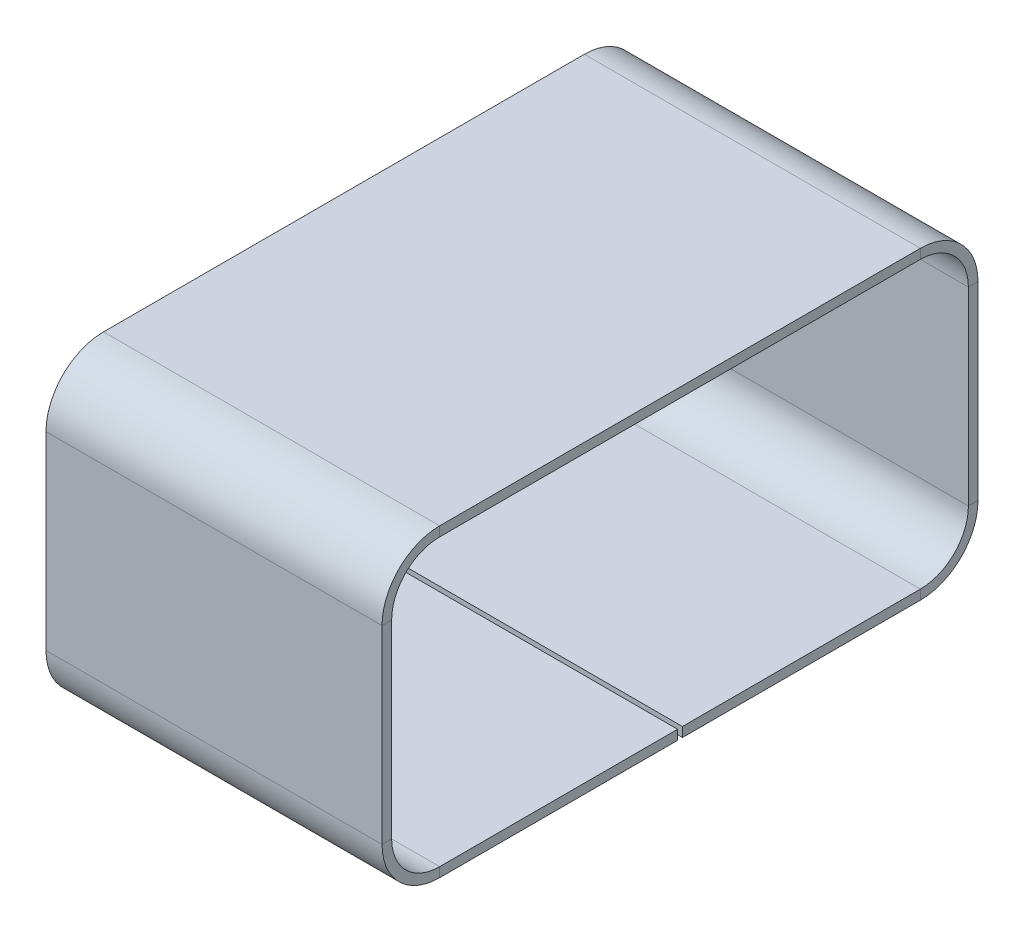
ISO-10303-21;
HEADER;
FILE_DESCRIPTION(('STEP AP214'),'2;1');
FILE_NAME('part.step','',(''),(''),'','','');
FILE_SCHEMA(('AUTOMOTIVE_DESIGN { 1 0 10303 214 1 1 1 1 }'));
ENDSEC;
DATA;
#1=APPLICATION_CONTEXT('core data for automotive mechanical design processes');
#2=APPLICATION_PROTOCOL_DEFINITION('international standard','automotive_design',2000,#1);
#3=PRODUCT_CONTEXT('',#1,'mechanical');
#4=PRODUCT('Part','Part','',(#3));
#5=PRODUCT_RELATED_PRODUCT_CATEGORY('part','',(#4));
#6=PRODUCT_DEFINITION_FORMATION('','',#4);
#7=PRODUCT_DEFINITION_CONTEXT('part definition',#1,'design');
#8=PRODUCT_DEFINITION('design','',#6,#7);
#9=PRODUCT_DEFINITION_SHAPE('','',#8);
#10=(LENGTH_UNIT() NAMED_UNIT(*) SI_UNIT(.MILLI.,.METRE.));
#11=(NAMED_UNIT(*) PLANE_ANGLE_UNIT() SI_UNIT($,.RADIAN.));
#12=(NAMED_UNIT(*) SI_UNIT($,.STERADIAN.) SOLID_ANGLE_UNIT());
#13=UNCERTAINTY_MEASURE_WITH_UNIT(LENGTH_MEASURE(1.E-05),#10,'distance_accuracy_value','');
#14=(GEOMETRIC_REPRESENTATION_CONTEXT(3) GLOBAL_UNCERTAINTY_ASSIGNED_CONTEXT((#13)) GLOBAL_UNIT_ASSIGNED_CONTEXT((#10,
#11,#12)) REPRESENTATION_CONTEXT('',''));
#15=CARTESIAN_POINT('',(0.,0.,0.));
#16=DIRECTION('',(0.,0.,1.));
#17=DIRECTION('',(1.,0.,0.));
#18=AXIS2_PLACEMENT_3D('',#15,#16,#17);
#19=CARTESIAN_POINT('',(109.,139.807427667901,-0.500000000000084));
#20=DIRECTION('',(0.,0.,1.));
#21=DIRECTION('',(1.,0.,0.));
#22=AXIS2_PLACEMENT_3D('',#19,#20,#21);
#23=PLANE('',#22);
#24=DIRECTION('',(-1.,0.,0.));
#25=VECTOR('',#24,1.);
#26=CARTESIAN_POINT('',(109.,-31.7404635223993,-0.500000000000084));
#27=LINE('',#26,#25);
#28=CARTESIAN_POINT('',(70.,-31.7404635223993,-0.500000000000084));
#29=VERTEX_POINT('',#28);
#30=CARTESIAN_POINT('',(0.,-31.7404635223993,-0.500000000000084));
#31=VERTEX_POINT('',#30);
#32=EDGE_CURVE('E223',#29,#31,#27,.T.);
#33=ORIENTED_EDGE('',*,*,#32,.F.);
#34=DIRECTION('',(0.,-1.,0.));
#35=VECTOR('',#34,1.);
#36=CARTESIAN_POINT('',(70.,139.807427667901,-0.500000000000084));
#37=LINE('',#36,#35);
#38=CARTESIAN_POINT('',(70.,-29.7404635223993,-0.500000000000084));
#39=VERTEX_POINT('',#38);
#40=EDGE_CURVE('E293',#39,#29,#37,.T.);
#41=ORIENTED_EDGE('',*,*,#40,.F.);
#42=DIRECTION('',(-1.,0.,0.));
#43=VECTOR('',#42,1.);
#44=CARTESIAN_POINT('',(109.,-29.7404635223993,-0.500000000000084));
#45=LINE('',#44,#43);
#46=CARTESIAN_POINT('',(0.,-29.7404635223993,-0.500000000000084));
#47=VERTEX_POINT('',#46);
#48=EDGE_CURVE('E105',#39,#47,#45,.T.);
#49=ORIENTED_EDGE('',*,*,#48,.T.);
#50=DIRECTION('',(0.,-1.,0.));
#51=VECTOR('',#50,1.);
#52=CARTESIAN_POINT('',(0.,139.807427667901,-0.500000000000084));
#53=LINE('',#52,#51);
#54=EDGE_CURVE('E245',#47,#31,#53,.T.);
#55=ORIENTED_EDGE('',*,*,#54,.T.);
#56=EDGE_LOOP('',(#33,#41,#49,#55));
#57=FACE_BOUND('',#56,.T.);
#58=ADVANCED_FACE('F67',(#57),#23,.T.);
#59=CARTESIAN_POINT('',(0.,139.807427667901,60.069847114549));
#60=DIRECTION('',(-1.,0.,0.));
#61=DIRECTION('',(0.,0.,1.));
#62=AXIS2_PLACEMENT_3D('',#59,#60,#61);
#63=PLANE('',#62);
#64=DIRECTION('',(0.,0.,-1.));
#65=VECTOR('',#64,1.);
#66=CARTESIAN_POINT('',(0.,-31.7404635223993,60.069847114549));
#67=LINE('',#66,#65);
#68=CARTESIAN_POINT('',(0.,-31.7404635223993,-50.069847114549));
#69=VERTEX_POINT('',#68);
#70=EDGE_CURVE('E224',#31,#69,#67,.T.);
#71=ORIENTED_EDGE('',*,*,#70,.F.);
#72=ORIENTED_EDGE('',*,*,#54,.F.);
#73=DIRECTION('',(0.,0.,-1.));
#74=VECTOR('',#73,1.);
#75=CARTESIAN_POINT('',(0.,-29.7404635223993,60.069847114549));
#76=LINE('',#75,#74);
#77=CARTESIAN_POINT('',(0.,-29.7404635223993,-50.069847114549));
#78=VERTEX_POINT('',#77);
#79=EDGE_CURVE('E242',#47,#78,#76,.T.);
#80=ORIENTED_EDGE('',*,*,#79,.T.);
#81=DIRECTION('',(0.,-1.,0.));
#82=VECTOR('',#81,1.);
#83=CARTESIAN_POINT('',(0.,139.807427667901,-50.069847114549));
#84=LINE('',#83,#82);
#85=EDGE_CURVE('E229',#78,#69,#84,.T.);
#86=ORIENTED_EDGE('',*,*,#85,.T.);
#87=EDGE_LOOP('',(#71,#72,#80,#86));
#88=FACE_BOUND('',#87,.T.);
#89=ADVANCED_FACE('F240',(#88),#63,.T.);
#90=CARTESIAN_POINT('',(70.,-31.7404635223993,60.069847114549));
#91=DIRECTION('',(0.,1.,0.));
#92=DIRECTION('',(0.,0.,1.));
#93=AXIS2_PLACEMENT_3D('',#90,#91,#92);
#94=PLANE('',#93);
#95=ORIENTED_EDGE('',*,*,#70,.T.);
#96=DIRECTION('',(1.,0.,0.));
#97=VECTOR('',#96,1.);
#98=CARTESIAN_POINT('',(0.,-31.7404635223993,-50.069847114549));
#99=LINE('',#98,#97);
#100=CARTESIAN_POINT('',(70.,-31.7404635223993,-50.069847114549));
#101=VERTEX_POINT('',#100);
#102=EDGE_CURVE('E214',#69,#101,#99,.T.);
#103=ORIENTED_EDGE('',*,*,#102,.T.);
#104=DIRECTION('',(0.,0.,-1.));
#105=VECTOR('',#104,1.);
#106=CARTESIAN_POINT('',(70.,-31.7404635223993,60.069847114549));
#107=LINE('',#106,#105);
#108=EDGE_CURVE('E77',#29,#101,#107,.T.);
#109=ORIENTED_EDGE('',*,*,#108,.F.);
#110=ORIENTED_EDGE('',*,*,#32,.T.);
#111=EDGE_LOOP('',(#95,#103,#109,#110));
#112=FACE_BOUND('',#111,.T.);
#113=ADVANCED_FACE('F236',(#112),#94,.F.);
#114=CARTESIAN_POINT('',(70.,139.807427667901,60.069847114549));
#115=DIRECTION('',(-1.,0.,0.));
#116=DIRECTION('',(0.,0.,1.));
#117=AXIS2_PLACEMENT_3D('',#114,#115,#116);
#118=PLANE('',#117);
#119=ORIENTED_EDGE('',*,*,#40,.T.);
#120=ORIENTED_EDGE('',*,*,#108,.T.);
#121=DIRECTION('',(0.,-1.,0.));
#122=VECTOR('',#121,1.);
#123=CARTESIAN_POINT('',(70.,139.807427667901,-50.069847114549));
#124=LINE('',#123,#122);
#125=CARTESIAN_POINT('',(70.,-29.7404635223993,-50.069847114549));
#126=VERTEX_POINT('',#125);
#127=EDGE_CURVE('E249',#126,#101,#124,.T.);
#128=ORIENTED_EDGE('',*,*,#127,.F.);
#129=DIRECTION('',(0.,0.,-1.));
#130=VECTOR('',#129,1.);
#131=CARTESIAN_POINT('',(70.,-29.7404635223993,60.069847114549));
#132=LINE('',#131,#130);
#133=EDGE_CURVE('E12',#39,#126,#132,.T.);
#134=ORIENTED_EDGE('',*,*,#133,.F.);
#135=EDGE_LOOP('',(#119,#120,#128,#134));
#136=FACE_BOUND('',#135,.T.);
#137=ADVANCED_FACE('F295',(#136),#118,.F.);
#138=CARTESIAN_POINT('',(70.,-29.7404635223993,60.069847114549));
#139=DIRECTION('',(0.,1.,0.));
#140=DIRECTION('',(0.,0.,1.));
#141=AXIS2_PLACEMENT_3D('',#138,#139,#140);
#142=PLANE('',#141);
#143=DIRECTION('',(1.,0.,0.));
#144=VECTOR('',#143,1.);
#145=CARTESIAN_POINT('',(0.,-29.7404635223993,-50.069847114549));
#146=LINE('',#145,#144);
#147=EDGE_CURVE('E71',#78,#126,#146,.T.);
#148=ORIENTED_EDGE('',*,*,#147,.F.);
#149=ORIENTED_EDGE('',*,*,#79,.F.);
#150=ORIENTED_EDGE('',*,*,#48,.F.);
#151=ORIENTED_EDGE('',*,*,#133,.T.);
#152=EDGE_LOOP('',(#148,#149,#150,#151));
#153=FACE_BOUND('',#152,.T.);
#154=ADVANCED_FACE('F69',(#153),#142,.T.);
#155=CARTESIAN_POINT('',(0.,29.7404635223993,98.6627706121179));
#156=DIRECTION('',(-1.,0.,0.));
#157=DIRECTION('',(0.,-1.,0.));
#158=AXIS2_PLACEMENT_3D('',#155,#156,#157);
#159=PLANE('',#158);
#160=DIRECTION('',(0.,1.,0.));
#161=VECTOR('',#160,1.);
#162=CARTESIAN_POINT('',(0.,29.7404635223993,-62.069847114549));
#163=LINE('',#162,#161);
#164=CARTESIAN_POINT('',(0.,-19.7404635223993,-62.069847114549));
#165=VERTEX_POINT('',#164);
#166=CARTESIAN_POINT('',(0.,19.7404635223993,-62.069847114549));
#167=VERTEX_POINT('',#166);
#168=EDGE_CURVE('E276',#165,#167,#163,.T.);
#169=ORIENTED_EDGE('',*,*,#168,.F.);
#170=DIRECTION('',(0.,0.,-1.));
#171=VECTOR('',#170,1.);
#172=CARTESIAN_POINT('',(0.,-19.7404635223993,98.6627706121179));
#173=LINE('',#172,#171);
#174=CARTESIAN_POINT('',(0.,-19.7404635223993,-60.069847114549));
#175=VERTEX_POINT('',#174);
#176=EDGE_CURVE('E232',#175,#165,#173,.T.);
#177=ORIENTED_EDGE('',*,*,#176,.F.);
#178=DIRECTION('',(0.,1.,0.));
#179=VECTOR('',#178,1.);
#180=CARTESIAN_POINT('',(0.,29.7404635223993,-60.069847114549));
#181=LINE('',#180,#179);
#182=CARTESIAN_POINT('',(0.,19.7404635223993,-60.069847114549));
#183=VERTEX_POINT('',#182);
#184=EDGE_CURVE('E282',#175,#183,#181,.T.);
#185=ORIENTED_EDGE('',*,*,#184,.T.);
#186=DIRECTION('',(0.,0.,-1.));
#187=VECTOR('',#186,1.);
#188=CARTESIAN_POINT('',(0.,19.7404635223993,98.6627706121179));
#189=LINE('',#188,#187);
#190=EDGE_CURVE('E279',#183,#167,#189,.T.);
#191=ORIENTED_EDGE('',*,*,#190,.T.);
#192=EDGE_LOOP('',(#169,#177,#185,#191));
#193=FACE_BOUND('',#192,.T.);
#194=ADVANCED_FACE('F298',(#193),#159,.T.);
#195=CARTESIAN_POINT('',(70.,29.7404635223993,-62.069847114549));
#196=DIRECTION('',(0.,0.,1.));
#197=DIRECTION('',(1.,0.,0.));
#198=AXIS2_PLACEMENT_3D('',#195,#196,#197);
#199=PLANE('',#198);
#200=DIRECTION('',(1.,0.,0.));
#201=VECTOR('',#200,1.);
#202=CARTESIAN_POINT('',(0.,-19.7404635223994,-62.069847114549));
#203=LINE('',#202,#201);
#204=CARTESIAN_POINT('',(70.,-19.7404635223993,-62.069847114549));
#205=VERTEX_POINT('',#204);
#206=EDGE_CURVE('E286',#165,#205,#203,.T.);
#207=ORIENTED_EDGE('',*,*,#206,.F.);
#208=ORIENTED_EDGE('',*,*,#168,.T.);
#209=DIRECTION('',(1.,0.,0.));
#210=VECTOR('',#209,1.);
#211=CARTESIAN_POINT('',(0.,19.7404635223993,-62.069847114549));
#212=LINE('',#211,#210);
#213=CARTESIAN_POINT('',(70.,19.7404635223993,-62.069847114549));
#214=VERTEX_POINT('',#213);
#215=EDGE_CURVE('E273',#167,#214,#212,.T.);
#216=ORIENTED_EDGE('',*,*,#215,.T.);
#217=DIRECTION('',(0.,1.,0.));
#218=VECTOR('',#217,1.);
#219=CARTESIAN_POINT('',(70.,29.7404635223993,-62.069847114549));
#220=LINE('',#219,#218);
#221=EDGE_CURVE('E262',#205,#214,#220,.T.);
#222=ORIENTED_EDGE('',*,*,#221,.F.);
#223=EDGE_LOOP('',(#207,#208,#216,#222));
#224=FACE_BOUND('',#223,.T.);
#225=ADVANCED_FACE('F303',(#224),#199,.F.);
#226=CARTESIAN_POINT('',(70.,29.7404635223993,98.6627706121179));
#227=DIRECTION('',(-1.,0.,0.));
#228=DIRECTION('',(0.,-1.,0.));
#229=AXIS2_PLACEMENT_3D('',#226,#227,#228);
#230=PLANE('',#229);
#231=DIRECTION('',(0.,0.,-1.));
#232=VECTOR('',#231,1.);
#233=CARTESIAN_POINT('',(70.,-19.7404635223993,98.6627706121179));
#234=LINE('',#233,#232);
#235=CARTESIAN_POINT('',(70.,-19.7404635223993,-60.069847114549));
#236=VERTEX_POINT('',#235);
#237=EDGE_CURVE('E270',#236,#205,#234,.T.);
#238=ORIENTED_EDGE('',*,*,#237,.T.);
#239=ORIENTED_EDGE('',*,*,#221,.T.);
#240=DIRECTION('',(0.,0.,-1.));
#241=VECTOR('',#240,1.);
#242=CARTESIAN_POINT('',(70.,19.7404635223993,98.6627706121179));
#243=LINE('',#242,#241);
#244=CARTESIAN_POINT('',(70.,19.7404635223993,-60.069847114549));
#245=VERTEX_POINT('',#244);
#246=EDGE_CURVE('E288',#245,#214,#243,.T.);
#247=ORIENTED_EDGE('',*,*,#246,.F.);
#248=DIRECTION('',(0.,1.,0.));
#249=VECTOR('',#248,1.);
#250=CARTESIAN_POINT('',(70.,29.7404635223993,-60.069847114549));
#251=LINE('',#250,#249);
#252=EDGE_CURVE('E252',#236,#245,#251,.T.);
#253=ORIENTED_EDGE('',*,*,#252,.F.);
#254=EDGE_LOOP('',(#238,#239,#247,#253));
#255=FACE_BOUND('',#254,.T.);
#256=ADVANCED_FACE('F344',(#255),#230,.F.);
#257=CARTESIAN_POINT('',(70.,29.7404635223993,-60.069847114549));
#258=DIRECTION('',(0.,0.,1.));
#259=DIRECTION('',(1.,0.,0.));
#260=AXIS2_PLACEMENT_3D('',#257,#258,#259);
#261=PLANE('',#260);
#262=ORIENTED_EDGE('',*,*,#184,.F.);
#263=DIRECTION('',(1.,0.,0.));
#264=VECTOR('',#263,1.);
#265=CARTESIAN_POINT('',(0.,-19.7404635223994,-60.069847114549));
#266=LINE('',#265,#264);
#267=EDGE_CURVE('E255',#175,#236,#266,.T.);
#268=ORIENTED_EDGE('',*,*,#267,.T.);
#269=ORIENTED_EDGE('',*,*,#252,.T.);
#270=DIRECTION('',(1.,0.,0.));
#271=VECTOR('',#270,1.);
#272=CARTESIAN_POINT('',(0.,19.7404635223993,-60.069847114549));
#273=LINE('',#272,#271);
#274=EDGE_CURVE('E290',#183,#245,#273,.T.);
#275=ORIENTED_EDGE('',*,*,#274,.F.);
#276=EDGE_LOOP('',(#262,#268,#269,#275));
#277=FACE_BOUND('',#276,.T.);
#278=ADVANCED_FACE('F313',(#277),#261,.T.);
#279=CARTESIAN_POINT('',(0.,-212.619585260516,60.069847114549));
#280=DIRECTION('',(-1.,0.,0.));
#281=DIRECTION('',(0.,0.,-1.));
#282=AXIS2_PLACEMENT_3D('',#279,#280,#281);
#283=PLANE('',#282);
#284=DIRECTION('',(0.,0.,1.));
#285=VECTOR('',#284,1.);
#286=CARTESIAN_POINT('',(0.,31.7404635223993,60.069847114549));
#287=LINE('',#286,#285);
#288=CARTESIAN_POINT('',(0.,31.7404635223993,-50.069847114549));
#289=VERTEX_POINT('',#288);
#290=CARTESIAN_POINT('',(-1.11022302462516E-13,31.7404635223993,50.069847114549));
#291=VERTEX_POINT('',#290);
#292=EDGE_CURVE('E891',#289,#291,#287,.T.);
#293=ORIENTED_EDGE('',*,*,#292,.F.);
#294=DIRECTION('',(0.,1.,0.));
#295=VECTOR('',#294,1.);
#296=CARTESIAN_POINT('',(0.,-212.619585260516,-50.069847114549));
#297=LINE('',#296,#295);
#298=CARTESIAN_POINT('',(0.,29.7404635223993,-50.069847114549));
#299=VERTEX_POINT('',#298);
#300=EDGE_CURVE('E991',#299,#289,#297,.T.);
#301=ORIENTED_EDGE('',*,*,#300,.F.);
#302=DIRECTION('',(0.,0.,1.));
#303=VECTOR('',#302,1.);
#304=CARTESIAN_POINT('',(0.,29.7404635223993,60.069847114549));
#305=LINE('',#304,#303);
#306=CARTESIAN_POINT('',(-1.11022302462516E-13,29.7404635223993,50.069847114549));
#307=VERTEX_POINT('',#306);
#308=EDGE_CURVE('E973',#299,#307,#305,.T.);
#309=ORIENTED_EDGE('',*,*,#308,.T.);
#310=DIRECTION('',(0.,1.,0.));
#311=VECTOR('',#310,1.);
#312=CARTESIAN_POINT('',(0.,-212.619585260516,50.069847114549));
#313=LINE('',#312,#311);
#314=EDGE_CURVE('E982',#307,#291,#313,.T.);
#315=ORIENTED_EDGE('',*,*,#314,.T.);
#316=EDGE_LOOP('',(#293,#301,#309,#315));
#317=FACE_BOUND('',#316,.T.);
#318=ADVANCED_FACE('F362',(#317),#283,.T.);
#319=CARTESIAN_POINT('',(70.,-212.619585260516,60.069847114549));
#320=DIRECTION('',(-1.,0.,0.));
#321=DIRECTION('',(0.,0.,-1.));
#322=AXIS2_PLACEMENT_3D('',#319,#320,#321);
#323=PLANE('',#322);
#324=DIRECTION('',(0.,1.,0.));
#325=VECTOR('',#324,1.);
#326=CARTESIAN_POINT('',(70.,-212.619585260516,-50.069847114549));
#327=LINE('',#326,#325);
#328=CARTESIAN_POINT('',(70.,29.7404635223993,-50.069847114549));
#329=VERTEX_POINT('',#328);
#330=CARTESIAN_POINT('',(70.,31.7404635223993,-50.069847114549));
#331=VERTEX_POINT('',#330);
#332=EDGE_CURVE('E988',#329,#331,#327,.T.);
#333=ORIENTED_EDGE('',*,*,#332,.T.);
#334=DIRECTION('',(0.,0.,1.));
#335=VECTOR('',#334,1.);
#336=CARTESIAN_POINT('',(70.,31.7404635223993,60.069847114549));
#337=LINE('',#336,#335);
#338=CARTESIAN_POINT('',(70.,31.7404635223993,50.069847114549));
#339=VERTEX_POINT('',#338);
#340=EDGE_CURVE('E968',#331,#339,#337,.T.);
#341=ORIENTED_EDGE('',*,*,#340,.T.);
#342=DIRECTION('',(0.,1.,0.));
#343=VECTOR('',#342,1.);
#344=CARTESIAN_POINT('',(70.,-212.619585260516,50.069847114549));
#345=LINE('',#344,#343);
#346=CARTESIAN_POINT('',(69.9999999999999,29.7404635223993,50.069847114549));
#347=VERTEX_POINT('',#346);
#348=EDGE_CURVE('E985',#347,#339,#345,.T.);
#349=ORIENTED_EDGE('',*,*,#348,.F.);
#350=DIRECTION('',(0.,0.,1.));
#351=VECTOR('',#350,1.);
#352=CARTESIAN_POINT('',(70.,29.7404635223993,60.069847114549));
#353=LINE('',#352,#351);
#354=EDGE_CURVE('E976',#329,#347,#353,.T.);
#355=ORIENTED_EDGE('',*,*,#354,.F.);
#356=EDGE_LOOP('',(#333,#341,#349,#355));
#357=FACE_BOUND('',#356,.T.);
#358=ADVANCED_FACE('F370',(#357),#323,.F.);
#359=CARTESIAN_POINT('',(70.,29.7404635223993,60.069847114549));
#360=DIRECTION('',(0.,-1.,0.));
#361=DIRECTION('',(0.,0.,-1.));
#362=AXIS2_PLACEMENT_3D('',#359,#360,#361);
#363=PLANE('',#362);
#364=ORIENTED_EDGE('',*,*,#308,.F.);
#365=DIRECTION('',(1.,0.,0.));
#366=VECTOR('',#365,1.);
#367=CARTESIAN_POINT('',(0.,29.7404635223993,-50.069847114549));
#368=LINE('',#367,#366);
#369=EDGE_CURVE('E979',#299,#329,#368,.T.);
#370=ORIENTED_EDGE('',*,*,#369,.T.);
#371=ORIENTED_EDGE('',*,*,#354,.T.);
#372=DIRECTION('',(1.,0.,0.));
#373=VECTOR('',#372,1.);
#374=CARTESIAN_POINT('',(0.,29.7404635223993,50.069847114549));
#375=LINE('',#374,#373);
#376=EDGE_CURVE('E992',#307,#347,#375,.T.);
#377=ORIENTED_EDGE('',*,*,#376,.F.);
#378=EDGE_LOOP('',(#364,#370,#371,#377));
#379=FACE_BOUND('',#378,.T.);
#380=ADVANCED_FACE('F380',(#379),#363,.T.);
#381=CARTESIAN_POINT('',(70.,31.7404635223993,60.069847114549));
#382=DIRECTION('',(0.,-1.,0.));
#383=DIRECTION('',(0.,0.,-1.));
#384=AXIS2_PLACEMENT_3D('',#381,#382,#383);
#385=PLANE('',#384);
#386=DIRECTION('',(1.,0.,0.));
#387=VECTOR('',#386,1.);
#388=CARTESIAN_POINT('',(0.,31.7404635223993,-50.069847114549));
#389=LINE('',#388,#387);
#390=EDGE_CURVE('E971',#289,#331,#389,.T.);
#391=ORIENTED_EDGE('',*,*,#390,.F.);
#392=ORIENTED_EDGE('',*,*,#292,.T.);
#393=DIRECTION('',(1.,0.,0.));
#394=VECTOR('',#393,1.);
#395=CARTESIAN_POINT('',(0.,31.7404635223993,50.069847114549));
#396=LINE('',#395,#394);
#397=EDGE_CURVE('E265',#291,#339,#396,.T.);
#398=ORIENTED_EDGE('',*,*,#397,.T.);
#399=ORIENTED_EDGE('',*,*,#340,.F.);
#400=EDGE_LOOP('',(#391,#392,#398,#399));
#401=FACE_BOUND('',#400,.T.);
#402=ADVANCED_FACE('F390',(#401),#385,.F.);
#403=CARTESIAN_POINT('',(109.,139.807427667901,0.5));
#404=DIRECTION('',(0.,0.,1.));
#405=DIRECTION('',(1.,0.,0.));
#406=AXIS2_PLACEMENT_3D('',#403,#404,#405);
#407=PLANE('',#406);
#408=DIRECTION('',(0.,-1.,0.));
#409=VECTOR('',#408,1.);
#410=CARTESIAN_POINT('',(70.,139.807427667901,0.5));
#411=LINE('',#410,#409);
#412=CARTESIAN_POINT('',(70.,-29.7404635223993,0.5));
#413=VERTEX_POINT('',#412);
#414=CARTESIAN_POINT('',(70.,-31.7404635223993,0.5));
#415=VERTEX_POINT('',#414);
#416=EDGE_CURVE('E959',#413,#415,#411,.T.);
#417=ORIENTED_EDGE('',*,*,#416,.T.);
#418=DIRECTION('',(-1.,0.,0.));
#419=VECTOR('',#418,1.);
#420=CARTESIAN_POINT('',(109.,-31.7404635223993,0.5));
#421=LINE('',#420,#419);
#422=CARTESIAN_POINT('',(0.,-31.7404635223993,0.5));
#423=VERTEX_POINT('',#422);
#424=EDGE_CURVE('E956',#415,#423,#421,.T.);
#425=ORIENTED_EDGE('',*,*,#424,.T.);
#426=DIRECTION('',(0.,-1.,0.));
#427=VECTOR('',#426,1.);
#428=CARTESIAN_POINT('',(0.,139.807427667901,0.5));
#429=LINE('',#428,#427);
#430=CARTESIAN_POINT('',(0.,-29.7404635223993,0.5));
#431=VERTEX_POINT('',#430);
#432=EDGE_CURVE('E933',#431,#423,#429,.T.);
#433=ORIENTED_EDGE('',*,*,#432,.F.);
#434=DIRECTION('',(-1.,0.,0.));
#435=VECTOR('',#434,1.);
#436=CARTESIAN_POINT('',(109.,-29.7404635223993,0.5));
#437=LINE('',#436,#435);
#438=EDGE_CURVE('E939',#413,#431,#437,.T.);
#439=ORIENTED_EDGE('',*,*,#438,.F.);
#440=EDGE_LOOP('',(#417,#425,#433,#439));
#441=FACE_BOUND('',#440,.T.);
#442=ADVANCED_FACE('F400',(#441),#407,.F.);
#443=CARTESIAN_POINT('',(70.,-31.7404635223993,60.069847114549));
#444=DIRECTION('',(0.,1.,0.));
#445=DIRECTION('',(0.,0.,1.));
#446=AXIS2_PLACEMENT_3D('',#443,#444,#445);
#447=PLANE('',#446);
#448=DIRECTION('',(1.,0.,0.));
#449=VECTOR('',#448,1.);
#450=CARTESIAN_POINT('',(0.,-31.7404635223993,50.069847114549));
#451=LINE('',#450,#449);
#452=CARTESIAN_POINT('',(0.,-31.7404635223993,50.069847114549));
#453=VERTEX_POINT('',#452);
#454=CARTESIAN_POINT('',(70.,-31.7404635223993,50.069847114549));
#455=VERTEX_POINT('',#454);
#456=EDGE_CURVE('E927',#453,#455,#451,.T.);
#457=ORIENTED_EDGE('',*,*,#456,.F.);
#458=DIRECTION('',(0.,0.,-1.));
#459=VECTOR('',#458,1.);
#460=CARTESIAN_POINT('',(0.,-31.7404635223993,60.069847114549));
#461=LINE('',#460,#459);
#462=EDGE_CURVE('E954',#453,#423,#461,.T.);
#463=ORIENTED_EDGE('',*,*,#462,.T.);
#464=ORIENTED_EDGE('',*,*,#424,.F.);
#465=DIRECTION('',(0.,0.,-1.));
#466=VECTOR('',#465,1.);
#467=CARTESIAN_POINT('',(70.,-31.7404635223993,60.069847114549));
#468=LINE('',#467,#466);
#469=EDGE_CURVE('E948',#455,#415,#468,.T.);
#470=ORIENTED_EDGE('',*,*,#469,.F.);
#471=EDGE_LOOP('',(#457,#463,#464,#470));
#472=FACE_BOUND('',#471,.T.);
#473=ADVANCED_FACE('F410',(#472),#447,.F.);
#474=CARTESIAN_POINT('',(70.,139.807427667901,60.069847114549));
#475=DIRECTION('',(-1.,0.,0.));
#476=DIRECTION('',(0.,0.,1.));
#477=AXIS2_PLACEMENT_3D('',#474,#475,#476);
#478=PLANE('',#477);
#479=DIRECTION('',(0.,-1.,0.));
#480=VECTOR('',#479,1.);
#481=CARTESIAN_POINT('',(70.,139.807427667901,50.069847114549));
#482=LINE('',#481,#480);
#483=CARTESIAN_POINT('',(70.,-29.7404635223993,50.069847114549));
#484=VERTEX_POINT('',#483);
#485=EDGE_CURVE('E951',#484,#455,#482,.T.);
#486=ORIENTED_EDGE('',*,*,#485,.T.);
#487=ORIENTED_EDGE('',*,*,#469,.T.);
#488=ORIENTED_EDGE('',*,*,#416,.F.);
#489=DIRECTION('',(0.,0.,-1.));
#490=VECTOR('',#489,1.);
#491=CARTESIAN_POINT('',(70.,-29.7404635223993,60.069847114549));
#492=LINE('',#491,#490);
#493=EDGE_CURVE('E942',#484,#413,#492,.T.);
#494=ORIENTED_EDGE('',*,*,#493,.F.);
#495=EDGE_LOOP('',(#486,#487,#488,#494));
#496=FACE_BOUND('',#495,.T.);
#497=ADVANCED_FACE('F420',(#496),#478,.F.);
#498=CARTESIAN_POINT('',(70.,-29.7404635223993,60.069847114549));
#499=DIRECTION('',(0.,1.,0.));
#500=DIRECTION('',(0.,0.,1.));
#501=AXIS2_PLACEMENT_3D('',#498,#499,#500);
#502=PLANE('',#501);
#503=DIRECTION('',(0.,0.,-1.));
#504=VECTOR('',#503,1.);
#505=CARTESIAN_POINT('',(0.,-29.7404635223993,60.069847114549));
#506=LINE('',#505,#504);
#507=CARTESIAN_POINT('',(0.,-29.7404635223993,50.069847114549));
#508=VERTEX_POINT('',#507);
#509=EDGE_CURVE('E936',#508,#431,#506,.T.);
#510=ORIENTED_EDGE('',*,*,#509,.F.);
#511=DIRECTION('',(1.,0.,0.));
#512=VECTOR('',#511,1.);
#513=CARTESIAN_POINT('',(0.,-29.7404635223993,50.069847114549));
#514=LINE('',#513,#512);
#515=EDGE_CURVE('E945',#508,#484,#514,.T.);
#516=ORIENTED_EDGE('',*,*,#515,.T.);
#517=ORIENTED_EDGE('',*,*,#493,.T.);
#518=ORIENTED_EDGE('',*,*,#438,.T.);
#519=EDGE_LOOP('',(#510,#516,#517,#518));
#520=FACE_BOUND('',#519,.T.);
#521=ADVANCED_FACE('F430',(#520),#502,.T.);
#522=CARTESIAN_POINT('',(0.,139.807427667901,60.069847114549));
#523=DIRECTION('',(-1.,0.,0.));
#524=DIRECTION('',(0.,0.,1.));
#525=AXIS2_PLACEMENT_3D('',#522,#523,#524);
#526=PLANE('',#525);
#527=ORIENTED_EDGE('',*,*,#462,.F.);
#528=DIRECTION('',(0.,-1.,0.));
#529=VECTOR('',#528,1.);
#530=CARTESIAN_POINT('',(0.,139.807427667901,50.069847114549));
#531=LINE('',#530,#529);
#532=EDGE_CURVE('E913',#508,#453,#531,.T.);
#533=ORIENTED_EDGE('',*,*,#532,.F.);
#534=ORIENTED_EDGE('',*,*,#509,.T.);
#535=ORIENTED_EDGE('',*,*,#432,.T.);
#536=EDGE_LOOP('',(#527,#533,#534,#535));
#537=FACE_BOUND('',#536,.T.);
#538=ADVANCED_FACE('F440',(#537),#526,.T.);
#539=CARTESIAN_POINT('',(-354.345009699976,-19.7404635223993,50.069847114549));
#540=DIRECTION('',(1.,0.,0.));
#541=DIRECTION('',(0.,0.,-1.));
#542=AXIS2_PLACEMENT_3D('',#539,#540,#541);
#543=CYLINDRICAL_SURFACE('',#542,12.);
#544=CARTESIAN_POINT('',(0.,-19.7404635223993,50.069847114549));
#545=DIRECTION('',(1.,0.,0.));
#546=DIRECTION('',(0.,0.,-1.));
#547=AXIS2_PLACEMENT_3D('',#544,#545,#546);
#548=CIRCLE('',#547,12.);
#549=CARTESIAN_POINT('',(0.,-19.7404635223993,62.069847114549));
#550=VERTEX_POINT('',#549);
#551=EDGE_CURVE('E930',#550,#453,#548,.T.);
#552=ORIENTED_EDGE('',*,*,#551,.T.);
#553=ORIENTED_EDGE('',*,*,#456,.T.);
#554=CARTESIAN_POINT('',(70.,-19.7404635223993,50.069847114549));
#555=DIRECTION('',(1.,0.,0.));
#556=DIRECTION('',(0.,0.,-1.));
#557=AXIS2_PLACEMENT_3D('',#554,#555,#556);
#558=CIRCLE('',#557,12.);
#559=CARTESIAN_POINT('',(70.,-19.7404635223993,62.069847114549));
#560=VERTEX_POINT('',#559);
#561=EDGE_CURVE('E925',#455,#560,#558,.F.);
#562=ORIENTED_EDGE('',*,*,#561,.T.);
#563=DIRECTION('',(1.,0.,0.));
#564=VECTOR('',#563,1.);
#565=CARTESIAN_POINT('',(0.,-19.7404635223993,62.069847114549));
#566=LINE('',#565,#564);
#567=EDGE_CURVE('E888',#550,#560,#566,.T.);
#568=ORIENTED_EDGE('',*,*,#567,.F.);
#569=EDGE_LOOP('',(#552,#553,#562,#568));
#570=FACE_BOUND('',#569,.T.);
#571=ADVANCED_FACE('F450',(#570),#543,.T.);
#572=CARTESIAN_POINT('',(70.,-19.7404635223993,50.069847114549));
#573=DIRECTION('',(1.,0.,0.));
#574=DIRECTION('',(0.,0.,-1.));
#575=AXIS2_PLACEMENT_3D('',#572,#573,#574);
#576=PLANE('',#575);
#577=ORIENTED_EDGE('',*,*,#485,.F.);
#578=CARTESIAN_POINT('',(70.,-19.7404635223993,50.069847114549));
#579=DIRECTION('',(1.,0.,0.));
#580=DIRECTION('',(0.,0.,-1.));
#581=AXIS2_PLACEMENT_3D('',#578,#579,#580);
#582=CIRCLE('',#581,10.);
#583=CARTESIAN_POINT('',(70.,-19.7404635223993,60.069847114549));
#584=VERTEX_POINT('',#583);
#585=EDGE_CURVE('E922',#484,#584,#582,.F.);
#586=ORIENTED_EDGE('',*,*,#585,.T.);
#587=DIRECTION('',(0.,0.,1.));
#588=VECTOR('',#587,1.);
#589=CARTESIAN_POINT('',(70.,-19.7404635223993,-98.6627706121179));
#590=LINE('',#589,#588);
#591=EDGE_CURVE('E919',#584,#560,#590,.T.);
#592=ORIENTED_EDGE('',*,*,#591,.T.);
#593=ORIENTED_EDGE('',*,*,#561,.F.);
#594=EDGE_LOOP('',(#577,#586,#592,#593));
#595=FACE_BOUND('',#594,.T.);
#596=ADVANCED_FACE('F460',(#595),#576,.T.);
#597=CARTESIAN_POINT('',(-354.345009699976,-19.7404635223993,50.069847114549));
#598=DIRECTION('',(1.,0.,0.));
#599=DIRECTION('',(0.,0.,-1.));
#600=AXIS2_PLACEMENT_3D('',#597,#598,#599);
#601=CYLINDRICAL_SURFACE('',#600,10.);
#602=CARTESIAN_POINT('',(0.,-19.7404635223993,50.069847114549));
#603=DIRECTION('',(1.,0.,0.));
#604=DIRECTION('',(0.,0.,-1.));
#605=AXIS2_PLACEMENT_3D('',#602,#603,#604);
#606=CIRCLE('',#605,10.);
#607=CARTESIAN_POINT('',(0.,-19.7404635223993,60.069847114549));
#608=VERTEX_POINT('',#607);
#609=EDGE_CURVE('E915',#608,#508,#606,.T.);
#610=ORIENTED_EDGE('',*,*,#609,.F.);
#611=DIRECTION('',(1.,0.,0.));
#612=VECTOR('',#611,1.);
#613=CARTESIAN_POINT('',(0.,-19.7404635223993,60.069847114549));
#614=LINE('',#613,#612);
#615=EDGE_CURVE('E917',#608,#584,#614,.T.);
#616=ORIENTED_EDGE('',*,*,#615,.T.);
#617=ORIENTED_EDGE('',*,*,#585,.F.);
#618=ORIENTED_EDGE('',*,*,#515,.F.);
#619=EDGE_LOOP('',(#610,#616,#617,#618));
#620=FACE_BOUND('',#619,.T.);
#621=ADVANCED_FACE('F470',(#620),#601,.F.);
#622=CARTESIAN_POINT('',(0.,-19.7404635223993,50.069847114549));
#623=DIRECTION('',(-1.,0.,0.));
#624=DIRECTION('',(0.,0.,1.));
#625=AXIS2_PLACEMENT_3D('',#622,#623,#624);
#626=PLANE('',#625);
#627=DIRECTION('',(0.,0.,1.));
#628=VECTOR('',#627,1.);
#629=CARTESIAN_POINT('',(0.,-19.7404635223993,-98.6627706121179));
#630=LINE('',#629,#628);
#631=EDGE_CURVE('E907',#608,#550,#630,.T.);
#632=ORIENTED_EDGE('',*,*,#631,.F.);
#633=ORIENTED_EDGE('',*,*,#609,.T.);
#634=ORIENTED_EDGE('',*,*,#532,.T.);
#635=ORIENTED_EDGE('',*,*,#551,.F.);
#636=EDGE_LOOP('',(#632,#633,#634,#635));
#637=FACE_BOUND('',#636,.T.);
#638=ADVANCED_FACE('F480',(#637),#626,.T.);
#639=CARTESIAN_POINT('',(0.,29.7404635223993,-98.6627706121179));
#640=DIRECTION('',(-1.,0.,0.));
#641=DIRECTION('',(0.,1.,0.));
#642=AXIS2_PLACEMENT_3D('',#639,#640,#641);
#643=PLANE('',#642);
#644=DIRECTION('',(0.,-1.,0.));
#645=VECTOR('',#644,1.);
#646=CARTESIAN_POINT('',(0.,29.7404635223993,62.069847114549));
#647=LINE('',#646,#645);
#648=CARTESIAN_POINT('',(-1.11022302462516E-13,19.7404635223993,62.069847114549));
#649=VERTEX_POINT('',#648);
#650=EDGE_CURVE('E892',#649,#550,#647,.T.);
#651=ORIENTED_EDGE('',*,*,#650,.F.);
#652=DIRECTION('',(0.,0.,1.));
#653=VECTOR('',#652,1.);
#654=CARTESIAN_POINT('',(0.,19.7404635223993,-98.6627706121179));
#655=LINE('',#654,#653);
#656=CARTESIAN_POINT('',(-1.11022302462516E-13,19.7404635223993,60.069847114549));
#657=VERTEX_POINT('',#656);
#658=EDGE_CURVE('E884',#657,#649,#655,.T.);
#659=ORIENTED_EDGE('',*,*,#658,.F.);
#660=DIRECTION('',(0.,-1.,0.));
#661=VECTOR('',#660,1.);
#662=CARTESIAN_POINT('',(0.,29.7404635223993,60.069847114549));
#663=LINE('',#662,#661);
#664=EDGE_CURVE('E910',#657,#608,#663,.T.);
#665=ORIENTED_EDGE('',*,*,#664,.T.);
#666=ORIENTED_EDGE('',*,*,#631,.T.);
#667=EDGE_LOOP('',(#651,#659,#665,#666));
#668=FACE_BOUND('',#667,.T.);
#669=ADVANCED_FACE('F490',(#668),#643,.T.);
#670=CARTESIAN_POINT('',(70.,29.7404635223993,60.069847114549));
#671=DIRECTION('',(0.,0.,-1.));
#672=DIRECTION('',(-1.,0.,0.));
#673=AXIS2_PLACEMENT_3D('',#670,#671,#672);
#674=PLANE('',#673);
#675=ORIENTED_EDGE('',*,*,#664,.F.);
#676=DIRECTION('',(1.,0.,0.));
#677=VECTOR('',#676,1.);
#678=CARTESIAN_POINT('',(0.,19.7404635223993,60.069847114549));
#679=LINE('',#678,#677);
#680=CARTESIAN_POINT('',(70.,19.7404635223993,60.069847114549));
#681=VERTEX_POINT('',#680);
#682=EDGE_CURVE('E904',#657,#681,#679,.T.);
#683=ORIENTED_EDGE('',*,*,#682,.T.);
#684=DIRECTION('',(0.,-1.,0.));
#685=VECTOR('',#684,1.);
#686=CARTESIAN_POINT('',(70.,29.7404635223993,60.069847114549));
#687=LINE('',#686,#685);
#688=EDGE_CURVE('E901',#681,#584,#687,.T.);
#689=ORIENTED_EDGE('',*,*,#688,.T.);
#690=ORIENTED_EDGE('',*,*,#615,.F.);
#691=EDGE_LOOP('',(#675,#683,#689,#690));
#692=FACE_BOUND('',#691,.T.);
#693=ADVANCED_FACE('F500',(#692),#674,.T.);
#694=CARTESIAN_POINT('',(70.,29.7404635223993,-98.6627706121179));
#695=DIRECTION('',(-1.,0.,0.));
#696=DIRECTION('',(0.,1.,0.));
#697=AXIS2_PLACEMENT_3D('',#694,#695,#696);
#698=PLANE('',#697);
#699=DIRECTION('',(0.,0.,1.));
#700=VECTOR('',#699,1.);
#701=CARTESIAN_POINT('',(70.,19.7404635223993,-98.6627706121179));
#702=LINE('',#701,#700);
#703=CARTESIAN_POINT('',(69.9999999999999,19.7404635223993,62.069847114549));
#704=VERTEX_POINT('',#703);
#705=EDGE_CURVE('E898',#681,#704,#702,.T.);
#706=ORIENTED_EDGE('',*,*,#705,.T.);
#707=DIRECTION('',(0.,-1.,0.));
#708=VECTOR('',#707,1.);
#709=CARTESIAN_POINT('',(70.,29.7404635223993,62.069847114549));
#710=LINE('',#709,#708);
#711=EDGE_CURVE('E895',#704,#560,#710,.T.);
#712=ORIENTED_EDGE('',*,*,#711,.T.);
#713=ORIENTED_EDGE('',*,*,#591,.F.);
#714=ORIENTED_EDGE('',*,*,#688,.F.);
#715=EDGE_LOOP('',(#706,#712,#713,#714));
#716=FACE_BOUND('',#715,.T.);
#717=ADVANCED_FACE('F510',(#716),#698,.F.);
#718=CARTESIAN_POINT('',(70.,29.7404635223993,62.069847114549));
#719=DIRECTION('',(0.,0.,-1.));
#720=DIRECTION('',(-1.,0.,0.));
#721=AXIS2_PLACEMENT_3D('',#718,#719,#720);
#722=PLANE('',#721);
#723=DIRECTION('',(1.,0.,0.));
#724=VECTOR('',#723,1.);
#725=CARTESIAN_POINT('',(0.,19.7404635223993,62.069847114549));
#726=LINE('',#725,#724);
#727=EDGE_CURVE('E962',#649,#704,#726,.T.);
#728=ORIENTED_EDGE('',*,*,#727,.F.);
#729=ORIENTED_EDGE('',*,*,#650,.T.);
#730=ORIENTED_EDGE('',*,*,#567,.T.);
#731=ORIENTED_EDGE('',*,*,#711,.F.);
#732=EDGE_LOOP('',(#728,#729,#730,#731));
#733=FACE_BOUND('',#732,.T.);
#734=ADVANCED_FACE('F520',(#733),#722,.F.);
#735=CARTESIAN_POINT('',(70.,19.7404635223993,50.069847114549));
#736=DIRECTION('',(1.,0.,0.));
#737=DIRECTION('',(0.,0.,-1.));
#738=AXIS2_PLACEMENT_3D('',#735,#736,#737);
#739=PLANE('',#738);
#740=ORIENTED_EDGE('',*,*,#705,.F.);
#741=CARTESIAN_POINT('',(69.9999999999999,19.7404635223993,50.069847114549));
#742=DIRECTION('',(1.,0.,0.));
#743=DIRECTION('',(0.,0.,-1.));
#744=AXIS2_PLACEMENT_3D('',#741,#742,#743);
#745=CIRCLE('',#744,10.);
#746=EDGE_CURVE('E882',#681,#347,#745,.F.);
#747=ORIENTED_EDGE('',*,*,#746,.T.);
#748=ORIENTED_EDGE('',*,*,#348,.T.);
#749=CARTESIAN_POINT('',(69.9999999999999,19.7404635223993,50.069847114549));
#750=DIRECTION('',(1.,0.,0.));
#751=DIRECTION('',(0.,0.,-1.));
#752=AXIS2_PLACEMENT_3D('',#749,#750,#751);
#753=CIRCLE('',#752,12.);
#754=EDGE_CURVE('E881',#704,#339,#753,.F.);
#755=ORIENTED_EDGE('',*,*,#754,.F.);
#756=EDGE_LOOP('',(#740,#747,#748,#755));
#757=FACE_BOUND('',#756,.T.);
#758=ADVANCED_FACE('F530',(#757),#739,.T.);
#759=CARTESIAN_POINT('',(0.,19.7404635223993,50.069847114549));
#760=DIRECTION('',(-1.,0.,0.));
#761=DIRECTION('',(0.,0.,1.));
#762=AXIS2_PLACEMENT_3D('',#759,#760,#761);
#763=PLANE('',#762);
#764=ORIENTED_EDGE('',*,*,#314,.F.);
#765=CARTESIAN_POINT('',(-1.11022302462516E-13,19.7404635223993,50.069847114549));
#766=DIRECTION('',(1.,0.,0.));
#767=DIRECTION('',(0.,0.,-1.));
#768=AXIS2_PLACEMENT_3D('',#765,#766,#767);
#769=CIRCLE('',#768,10.);
#770=EDGE_CURVE('E873',#307,#657,#769,.T.);
#771=ORIENTED_EDGE('',*,*,#770,.T.);
#772=ORIENTED_EDGE('',*,*,#658,.T.);
#773=CARTESIAN_POINT('',(-1.11022302462516E-13,19.7404635223993,50.069847114549));
#774=DIRECTION('',(1.,0.,0.));
#775=DIRECTION('',(0.,0.,-1.));
#776=AXIS2_PLACEMENT_3D('',#773,#774,#775);
#777=CIRCLE('',#776,12.);
#778=EDGE_CURVE('E878',#291,#649,#777,.T.);
#779=ORIENTED_EDGE('',*,*,#778,.F.);
#780=EDGE_LOOP('',(#764,#771,#772,#779));
#781=FACE_BOUND('',#780,.T.);
#782=ADVANCED_FACE('F540',(#781),#763,.T.);
#783=CARTESIAN_POINT('',(-307.004210964322,19.7404635223993,50.069847114549));
#784=DIRECTION('',(1.,0.,0.));
#785=DIRECTION('',(0.,0.,-1.));
#786=AXIS2_PLACEMENT_3D('',#783,#784,#785);
#787=CYLINDRICAL_SURFACE('',#786,12.);
#788=ORIENTED_EDGE('',*,*,#778,.T.);
#789=ORIENTED_EDGE('',*,*,#727,.T.);
#790=ORIENTED_EDGE('',*,*,#754,.T.);
#791=ORIENTED_EDGE('',*,*,#397,.F.);
#792=EDGE_LOOP('',(#788,#789,#790,#791));
#793=FACE_BOUND('',#792,.T.);
#794=ADVANCED_FACE('F550',(#793),#787,.T.);
#795=CARTESIAN_POINT('',(-307.004210964322,19.7404635223993,50.069847114549));
#796=DIRECTION('',(1.,0.,0.));
#797=DIRECTION('',(0.,0.,-1.));
#798=AXIS2_PLACEMENT_3D('',#795,#796,#797);
#799=CYLINDRICAL_SURFACE('',#798,10.);
#800=ORIENTED_EDGE('',*,*,#770,.F.);
#801=ORIENTED_EDGE('',*,*,#376,.T.);
#802=ORIENTED_EDGE('',*,*,#746,.F.);
#803=ORIENTED_EDGE('',*,*,#682,.F.);
#804=EDGE_LOOP('',(#800,#801,#802,#803));
#805=FACE_BOUND('',#804,.T.);
#806=ADVANCED_FACE('F560',(#805),#799,.F.);
#807=CARTESIAN_POINT('',(70.,19.7404635223993,-50.069847114549));
#808=DIRECTION('',(1.,0.,0.));
#809=DIRECTION('',(0.,0.,-1.));
#810=AXIS2_PLACEMENT_3D('',#807,#808,#809);
#811=PLANE('',#810);
#812=ORIENTED_EDGE('',*,*,#332,.F.);
#813=CARTESIAN_POINT('',(70.,19.7404635223993,-50.069847114549));
#814=DIRECTION('',(1.,0.,0.));
#815=DIRECTION('',(0.,0.,-1.));
#816=AXIS2_PLACEMENT_3D('',#813,#814,#815);
#817=CIRCLE('',#816,10.);
#818=EDGE_CURVE('E871',#329,#245,#817,.F.);
#819=ORIENTED_EDGE('',*,*,#818,.T.);
#820=ORIENTED_EDGE('',*,*,#246,.T.);
#821=CARTESIAN_POINT('',(70.,19.7404635223993,-50.069847114549));
#822=DIRECTION('',(1.,0.,0.));
#823=DIRECTION('',(0.,0.,-1.));
#824=AXIS2_PLACEMENT_3D('',#821,#822,#823);
#825=CIRCLE('',#824,12.);
#826=EDGE_CURVE('E112',#331,#214,#825,.F.);
#827=ORIENTED_EDGE('',*,*,#826,.F.);
#828=EDGE_LOOP('',(#812,#819,#820,#827));
#829=FACE_BOUND('',#828,.T.);
#830=ADVANCED_FACE('F570',(#829),#811,.T.);
#831=CARTESIAN_POINT('',(0.,19.7404635223993,-50.069847114549));
#832=DIRECTION('',(-1.,0.,0.));
#833=DIRECTION('',(0.,0.,1.));
#834=AXIS2_PLACEMENT_3D('',#831,#832,#833);
#835=PLANE('',#834);
#836=ORIENTED_EDGE('',*,*,#190,.F.);
#837=CARTESIAN_POINT('',(0.,19.7404635223993,-50.069847114549));
#838=DIRECTION('',(1.,0.,0.));
#839=DIRECTION('',(0.,0.,-1.));
#840=AXIS2_PLACEMENT_3D('',#837,#838,#839);
#841=CIRCLE('',#840,10.);
#842=EDGE_CURVE('E874',#183,#299,#841,.T.);
#843=ORIENTED_EDGE('',*,*,#842,.T.);
#844=ORIENTED_EDGE('',*,*,#300,.T.);
#845=CARTESIAN_POINT('',(0.,19.7404635223993,-50.069847114549));
#846=DIRECTION('',(1.,0.,0.));
#847=DIRECTION('',(0.,0.,-1.));
#848=AXIS2_PLACEMENT_3D('',#845,#846,#847);
#849=CIRCLE('',#848,12.);
#850=EDGE_CURVE('E868',#167,#289,#849,.T.);
#851=ORIENTED_EDGE('',*,*,#850,.F.);
#852=EDGE_LOOP('',(#836,#843,#844,#851));
#853=FACE_BOUND('',#852,.T.);
#854=ADVANCED_FACE('F580',(#853),#835,.T.);
#855=CARTESIAN_POINT('',(-253.982168164445,19.7404635223993,-50.069847114549));
#856=DIRECTION('',(1.,0.,0.));
#857=DIRECTION('',(0.,0.,-1.));
#858=AXIS2_PLACEMENT_3D('',#855,#856,#857);
#859=CYLINDRICAL_SURFACE('',#858,12.);
#860=ORIENTED_EDGE('',*,*,#850,.T.);
#861=ORIENTED_EDGE('',*,*,#390,.T.);
#862=ORIENTED_EDGE('',*,*,#826,.T.);
#863=ORIENTED_EDGE('',*,*,#215,.F.);
#864=EDGE_LOOP('',(#860,#861,#862,#863));
#865=FACE_BOUND('',#864,.T.);
#866=ADVANCED_FACE('F590',(#865),#859,.T.);
#867=CARTESIAN_POINT('',(-253.982168164445,19.7404635223993,-50.069847114549));
#868=DIRECTION('',(1.,0.,0.));
#869=DIRECTION('',(0.,0.,-1.));
#870=AXIS2_PLACEMENT_3D('',#867,#868,#869);
#871=CYLINDRICAL_SURFACE('',#870,10.);
#872=ORIENTED_EDGE('',*,*,#842,.F.);
#873=ORIENTED_EDGE('',*,*,#274,.T.);
#874=ORIENTED_EDGE('',*,*,#818,.F.);
#875=ORIENTED_EDGE('',*,*,#369,.F.);
#876=EDGE_LOOP('',(#872,#873,#874,#875));
#877=FACE_BOUND('',#876,.T.);
#878=ADVANCED_FACE('F600',(#877),#871,.F.);
#879=CARTESIAN_POINT('',(70.,-19.7404635223993,-50.069847114549));
#880=DIRECTION('',(1.,0.,0.));
#881=DIRECTION('',(0.,0.,-1.));
#882=AXIS2_PLACEMENT_3D('',#879,#880,#881);
#883=PLANE('',#882);
#884=ORIENTED_EDGE('',*,*,#237,.F.);
#885=CARTESIAN_POINT('',(70.,-19.7404635223993,-50.069847114549));
#886=DIRECTION('',(1.,0.,0.));
#887=DIRECTION('',(0.,0.,-1.));
#888=AXIS2_PLACEMENT_3D('',#885,#886,#887);
#889=CIRCLE('',#888,9.99999999999999);
#890=EDGE_CURVE('E233',#236,#126,#889,.F.);
#891=ORIENTED_EDGE('',*,*,#890,.T.);
#892=ORIENTED_EDGE('',*,*,#127,.T.);
#893=CARTESIAN_POINT('',(70.,-19.7404635223993,-50.069847114549));
#894=DIRECTION('',(1.,0.,0.));
#895=DIRECTION('',(0.,0.,-1.));
#896=AXIS2_PLACEMENT_3D('',#893,#894,#895);
#897=CIRCLE('',#896,12.);
#898=EDGE_CURVE('E220',#205,#101,#897,.F.);
#899=ORIENTED_EDGE('',*,*,#898,.F.);
#900=EDGE_LOOP('',(#884,#891,#892,#899));
#901=FACE_BOUND('',#900,.T.);
#902=ADVANCED_FACE('F609',(#901),#883,.T.);
#903=CARTESIAN_POINT('',(0.,-19.7404635223993,-50.069847114549));
#904=DIRECTION('',(-1.,0.,0.));
#905=DIRECTION('',(0.,0.,1.));
#906=AXIS2_PLACEMENT_3D('',#903,#904,#905);
#907=PLANE('',#906);
#908=ORIENTED_EDGE('',*,*,#85,.F.);
#909=CARTESIAN_POINT('',(0.,-19.7404635223993,-50.069847114549));
#910=DIRECTION('',(1.,0.,0.));
#911=DIRECTION('',(0.,0.,-1.));
#912=AXIS2_PLACEMENT_3D('',#909,#910,#911);
#913=CIRCLE('',#912,9.99999999999999);
#914=EDGE_CURVE('E862',#78,#175,#913,.T.);
#915=ORIENTED_EDGE('',*,*,#914,.T.);
#916=ORIENTED_EDGE('',*,*,#176,.T.);
#917=CARTESIAN_POINT('',(0.,-19.7404635223993,-50.069847114549));
#918=DIRECTION('',(1.,0.,0.));
#919=DIRECTION('',(0.,0.,-1.));
#920=AXIS2_PLACEMENT_3D('',#917,#918,#919);
#921=CIRCLE('',#920,12.);
#922=EDGE_CURVE('E218',#69,#165,#921,.T.);
#923=ORIENTED_EDGE('',*,*,#922,.F.);
#924=EDGE_LOOP('',(#908,#915,#916,#923));
#925=FACE_BOUND('',#924,.T.);
#926=ADVANCED_FACE('F227',(#925),#907,.T.);
#927=CARTESIAN_POINT('',(-185.236449549635,-19.7404635223993,-50.069847114549));
#928=DIRECTION('',(1.,0.,0.));
#929=DIRECTION('',(0.,0.,-1.));
#930=AXIS2_PLACEMENT_3D('',#927,#928,#929);
#931=CYLINDRICAL_SURFACE('',#930,12.);
#932=ORIENTED_EDGE('',*,*,#922,.T.);
#933=ORIENTED_EDGE('',*,*,#206,.T.);
#934=ORIENTED_EDGE('',*,*,#898,.T.);
#935=ORIENTED_EDGE('',*,*,#102,.F.);
#936=EDGE_LOOP('',(#932,#933,#934,#935));
#937=FACE_BOUND('',#936,.T.);
#938=ADVANCED_FACE('F216',(#937),#931,.T.);
#939=CARTESIAN_POINT('',(-185.236449549635,-19.7404635223993,-50.069847114549));
#940=DIRECTION('',(1.,0.,0.));
#941=DIRECTION('',(0.,0.,-1.));
#942=AXIS2_PLACEMENT_3D('',#939,#940,#941);
#943=CYLINDRICAL_SURFACE('',#942,9.99999999999999);
#944=ORIENTED_EDGE('',*,*,#914,.F.);
#945=ORIENTED_EDGE('',*,*,#147,.T.);
#946=ORIENTED_EDGE('',*,*,#890,.F.);
#947=ORIENTED_EDGE('',*,*,#267,.F.);
#948=EDGE_LOOP('',(#944,#945,#946,#947));
#949=FACE_BOUND('',#948,.T.);
#950=ADVANCED_FACE('F635',(#949),#943,.F.);
#951=CLOSED_SHELL('',(#58,#89,#113,#137,#154,#194,#225,#256,#278,#318,#358,#380,#402,#442,#473,
#497,#521,#538,#571,#596,#621,#638,#669,#693,#717,#734,#758,#782,#794,#806,#830,#854,#866,#878,
#902,#926,#938,#950));
#952=MANIFOLD_SOLID_BREP('B2',#951);
#953=ADVANCED_BREP_SHAPE_REPRESENTATION('',(#18,#952),#14);
#954=SHAPE_DEFINITION_REPRESENTATION(#9,#953);
ENDSEC;
END-ISO-10303-21;
